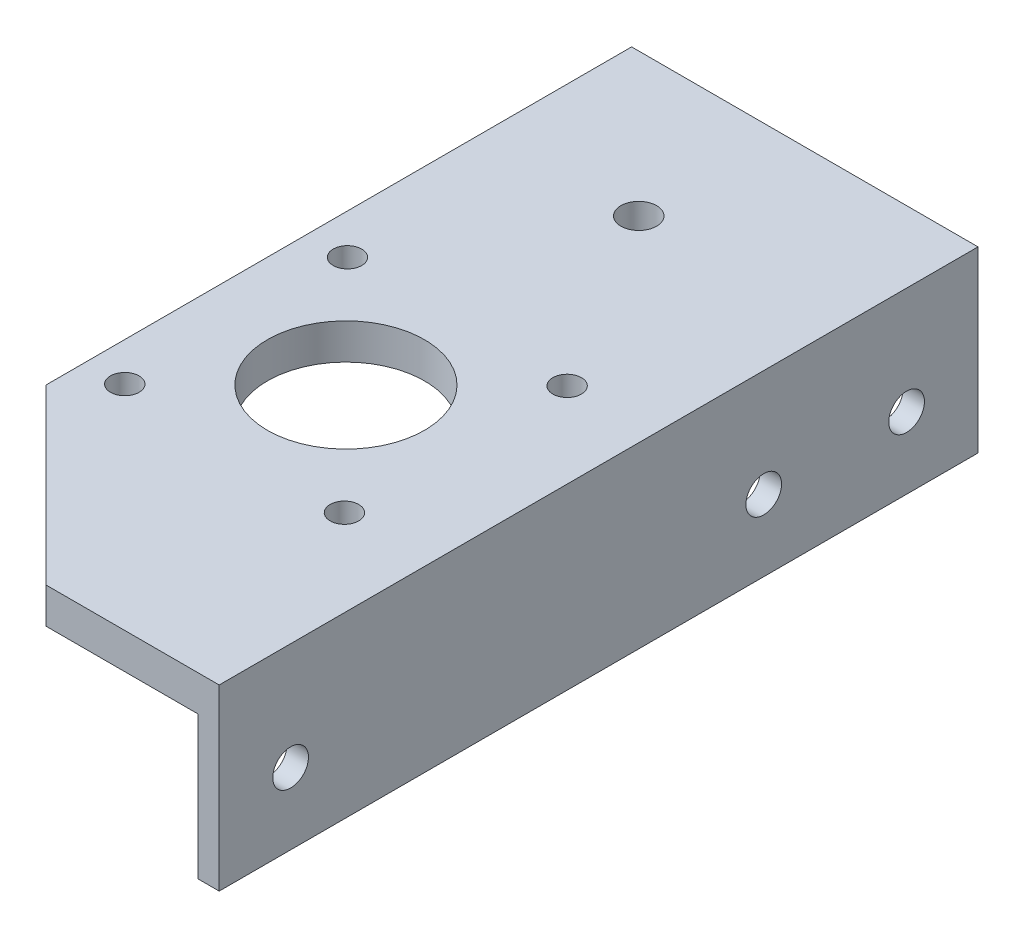
ISO-10303-21;
HEADER;
FILE_DESCRIPTION(('STEP AP214'),'2;1');
FILE_NAME('part.step','',(''),(''),'','','');
FILE_SCHEMA(('AUTOMOTIVE_DESIGN { 1 0 10303 214 1 1 1 1 }'));
ENDSEC;
DATA;
#1=APPLICATION_CONTEXT('core data for automotive mechanical design processes');
#2=APPLICATION_PROTOCOL_DEFINITION('international standard','automotive_design',2000,#1);
#3=PRODUCT_CONTEXT('',#1,'mechanical');
#4=PRODUCT('Part','Part','',(#3));
#5=PRODUCT_RELATED_PRODUCT_CATEGORY('part','',(#4));
#6=PRODUCT_DEFINITION_FORMATION('','',#4);
#7=PRODUCT_DEFINITION_CONTEXT('part definition',#1,'design');
#8=PRODUCT_DEFINITION('design','',#6,#7);
#9=PRODUCT_DEFINITION_SHAPE('','',#8);
#10=(LENGTH_UNIT() NAMED_UNIT(*) SI_UNIT(.MILLI.,.METRE.));
#11=(NAMED_UNIT(*) PLANE_ANGLE_UNIT() SI_UNIT($,.RADIAN.));
#12=(NAMED_UNIT(*) SI_UNIT($,.STERADIAN.) SOLID_ANGLE_UNIT());
#13=UNCERTAINTY_MEASURE_WITH_UNIT(LENGTH_MEASURE(1.E-05),#10,'distance_accuracy_value','');
#14=(GEOMETRIC_REPRESENTATION_CONTEXT(3) GLOBAL_UNCERTAINTY_ASSIGNED_CONTEXT((#13)) GLOBAL_UNIT_ASSIGNED_CONTEXT((#10,
#11,#12)) REPRESENTATION_CONTEXT('',''));
#15=CARTESIAN_POINT('',(0.,0.,0.));
#16=DIRECTION('',(0.,0.,1.));
#17=DIRECTION('',(1.,0.,0.));
#18=AXIS2_PLACEMENT_3D('',#15,#16,#17);
#19=CARTESIAN_POINT('',(0.,5.,80.));
#20=DIRECTION('',(0.,-1.,0.));
#21=DIRECTION('',(0.,0.,-1.));
#22=AXIS2_PLACEMENT_3D('',#19,#20,#21);
#23=PLANE('',#22);
#24=CARTESIAN_POINT('',(0.,5.,39.));
#25=DIRECTION('',(0.,-1.,0.));
#26=DIRECTION('',(0.,0.,-1.));
#27=AXIS2_PLACEMENT_3D('',#24,#25,#26);
#28=CIRCLE('',#27,2.5);
#29=CARTESIAN_POINT('',(0.,4.99999999999999,36.5));
#30=VERTEX_POINT('',#29);
#31=EDGE_CURVE('E229',#30,#30,#28,.T.);
#32=ORIENTED_EDGE('',*,*,#31,.T.);
#33=EDGE_LOOP('',(#32));
#34=FACE_BOUND('',#33,.T.);
#35=DIRECTION('',(-1.,0.,0.));
#36=VECTOR('',#35,1.);
#37=CARTESIAN_POINT('',(-21.,5.,19.));
#38=LINE('',#37,#36);
#39=CARTESIAN_POINT('',(27.5,5.,19.));
#40=VERTEX_POINT('',#39);
#41=CARTESIAN_POINT('',(-21.,5.,19.));
#42=VERTEX_POINT('',#41);
#43=EDGE_CURVE('E177',#40,#42,#38,.T.);
#44=ORIENTED_EDGE('',*,*,#43,.T.);
#45=DIRECTION('',(0.,0.,1.));
#46=VECTOR('',#45,1.);
#47=CARTESIAN_POINT('',(-21.,5.,101.));
#48=LINE('',#47,#46);
#49=CARTESIAN_POINT('',(-21.,5.,101.));
#50=VERTEX_POINT('',#49);
#51=EDGE_CURVE('E109',#42,#50,#48,.T.);
#52=ORIENTED_EDGE('',*,*,#51,.T.);
#53=DIRECTION('',(-0.707106781186548,0.,-0.707106781186548));
#54=VECTOR('',#53,1.);
#55=CARTESIAN_POINT('',(3.25000000000001,5.,125.25));
#56=LINE('',#55,#54);
#57=CARTESIAN_POINT('',(3.25000000000001,5.,125.25));
#58=VERTEX_POINT('',#57);
#59=EDGE_CURVE('E105',#58,#50,#56,.T.);
#60=ORIENTED_EDGE('',*,*,#59,.F.);
#61=DIRECTION('',(-1.,0.,0.));
#62=VECTOR('',#61,1.);
#63=CARTESIAN_POINT('',(3.25000000000001,5.,125.25));
#64=LINE('',#63,#62);
#65=CARTESIAN_POINT('',(27.5,5.,125.25));
#66=VERTEX_POINT('',#65);
#67=EDGE_CURVE('E152',#66,#58,#64,.T.);
#68=ORIENTED_EDGE('',*,*,#67,.F.);
#69=DIRECTION('',(0.,0.,-1.));
#70=VECTOR('',#69,1.);
#71=CARTESIAN_POINT('',(27.5,5.,126.831182706179));
#72=LINE('',#71,#70);
#73=EDGE_CURVE('E165',#66,#40,#72,.T.);
#74=ORIENTED_EDGE('',*,*,#73,.T.);
#75=EDGE_LOOP('',(#44,#52,#60,#68,#74));
#76=FACE_BOUND('',#75,.T.);
#77=CARTESIAN_POINT('',(0.,5.,80.));
#78=DIRECTION('',(0.,1.,0.));
#79=DIRECTION('',(0.,0.,1.));
#80=AXIS2_PLACEMENT_3D('',#77,#78,#79);
#81=CIRCLE('',#80,11.);
#82=CARTESIAN_POINT('',(0.,5.,91.));
#83=VERTEX_POINT('',#82);
#84=EDGE_CURVE('E120',#83,#83,#81,.T.);
#85=ORIENTED_EDGE('',*,*,#84,.F.);
#86=EDGE_LOOP('',(#85));
#87=FACE_BOUND('',#86,.T.);
#88=CARTESIAN_POINT('',(-15.592519129157,5.,95.3780150606921));
#89=DIRECTION('',(0.,1.,0.));
#90=DIRECTION('',(0.,0.,1.));
#91=AXIS2_PLACEMENT_3D('',#88,#89,#90);
#92=CIRCLE('',#91,2.);
#93=CARTESIAN_POINT('',(-15.592519129157,5.,97.3780150606921));
#94=VERTEX_POINT('',#93);
#95=EDGE_CURVE('E199',#94,#94,#92,.T.);
#96=ORIENTED_EDGE('',*,*,#95,.F.);
#97=EDGE_LOOP('',(#96));
#98=FACE_BOUND('',#97,.T.);
#99=CARTESIAN_POINT('',(-15.3780150606921,5.,64.407480870843));
#100=DIRECTION('',(0.,1.,0.));
#101=DIRECTION('',(0.,0.,1.));
#102=AXIS2_PLACEMENT_3D('',#99,#100,#101);
#103=CIRCLE('',#102,2.);
#104=CARTESIAN_POINT('',(-15.3780150606921,5.,66.407480870843));
#105=VERTEX_POINT('',#104);
#106=EDGE_CURVE('E193',#105,#105,#103,.T.);
#107=ORIENTED_EDGE('',*,*,#106,.F.);
#108=EDGE_LOOP('',(#107));
#109=FACE_BOUND('',#108,.T.);
#110=CARTESIAN_POINT('',(15.592519129157,5.,64.6219849393079));
#111=DIRECTION('',(0.,1.,0.));
#112=DIRECTION('',(0.,0.,1.));
#113=AXIS2_PLACEMENT_3D('',#110,#111,#112);
#114=CIRCLE('',#113,2.);
#115=CARTESIAN_POINT('',(15.592519129157,5.,66.6219849393079));
#116=VERTEX_POINT('',#115);
#117=EDGE_CURVE('E187',#116,#116,#114,.T.);
#118=ORIENTED_EDGE('',*,*,#117,.F.);
#119=EDGE_LOOP('',(#118));
#120=FACE_BOUND('',#119,.T.);
#121=CARTESIAN_POINT('',(15.3780150606921,5.,95.592519129157));
#122=DIRECTION('',(0.,1.,0.));
#123=DIRECTION('',(0.,0.,1.));
#124=AXIS2_PLACEMENT_3D('',#121,#122,#123);
#125=CIRCLE('',#124,2.);
#126=CARTESIAN_POINT('',(15.3780150606921,5.,97.5925191291571));
#127=VERTEX_POINT('',#126);
#128=EDGE_CURVE('E181',#127,#127,#125,.T.);
#129=ORIENTED_EDGE('',*,*,#128,.F.);
#130=EDGE_LOOP('',(#129));
#131=FACE_BOUND('',#130,.T.);
#132=ADVANCED_FACE('F37',(#34,#76,#87,#98,#109,#120,#131),#23,.F.);
#133=CARTESIAN_POINT('',(0.,0.,80.));
#134=DIRECTION('',(0.,-1.,0.));
#135=DIRECTION('',(0.,0.,-1.));
#136=AXIS2_PLACEMENT_3D('',#133,#134,#135);
#137=PLANE('',#136);
#138=CARTESIAN_POINT('',(0.,0.,39.));
#139=DIRECTION('',(0.,1.,0.));
#140=DIRECTION('',(0.,0.,1.));
#141=AXIS2_PLACEMENT_3D('',#138,#139,#140);
#142=CIRCLE('',#141,2.5);
#143=CARTESIAN_POINT('',(0.,0.,36.5));
#144=VERTEX_POINT('',#143);
#145=EDGE_CURVE('E41',#144,#144,#142,.T.);
#146=ORIENTED_EDGE('',*,*,#145,.T.);
#147=EDGE_LOOP('',(#146));
#148=FACE_BOUND('',#147,.T.);
#149=CARTESIAN_POINT('',(15.592519129157,0.,64.6219849393079));
#150=DIRECTION('',(0.,1.,0.));
#151=DIRECTION('',(0.,0.,1.));
#152=AXIS2_PLACEMENT_3D('',#149,#150,#151);
#153=CIRCLE('',#152,2.);
#154=CARTESIAN_POINT('',(15.592519129157,0.,66.6219849393079));
#155=VERTEX_POINT('',#154);
#156=EDGE_CURVE('E184',#155,#155,#153,.T.);
#157=ORIENTED_EDGE('',*,*,#156,.T.);
#158=EDGE_LOOP('',(#157));
#159=FACE_BOUND('',#158,.T.);
#160=CARTESIAN_POINT('',(-15.592519129157,0.,95.3780150606921));
#161=DIRECTION('',(0.,1.,0.));
#162=DIRECTION('',(0.,0.,1.));
#163=AXIS2_PLACEMENT_3D('',#160,#161,#162);
#164=CIRCLE('',#163,2.);
#165=CARTESIAN_POINT('',(-15.592519129157,0.,97.3780150606921));
#166=VERTEX_POINT('',#165);
#167=EDGE_CURVE('E196',#166,#166,#164,.T.);
#168=ORIENTED_EDGE('',*,*,#167,.T.);
#169=EDGE_LOOP('',(#168));
#170=FACE_BOUND('',#169,.T.);
#171=DIRECTION('',(0.,0.,1.));
#172=VECTOR('',#171,1.);
#173=CARTESIAN_POINT('',(-21.,0.,101.));
#174=LINE('',#173,#172);
#175=CARTESIAN_POINT('',(-21.,0.,19.));
#176=VERTEX_POINT('',#175);
#177=CARTESIAN_POINT('',(-21.,0.,101.));
#178=VERTEX_POINT('',#177);
#179=EDGE_CURVE('E116',#176,#178,#174,.T.);
#180=ORIENTED_EDGE('',*,*,#179,.F.);
#181=DIRECTION('',(1.,0.,0.));
#182=VECTOR('',#181,1.);
#183=CARTESIAN_POINT('',(-21.,0.,19.));
#184=LINE('',#183,#182);
#185=CARTESIAN_POINT('',(24.5,0.,19.));
#186=VERTEX_POINT('',#185);
#187=EDGE_CURVE('E175',#176,#186,#184,.T.);
#188=ORIENTED_EDGE('',*,*,#187,.T.);
#189=DIRECTION('',(0.,0.,-1.));
#190=VECTOR('',#189,1.);
#191=CARTESIAN_POINT('',(24.5,0.,126.831182706179));
#192=LINE('',#191,#190);
#193=CARTESIAN_POINT('',(24.5,0.,125.25));
#194=VERTEX_POINT('',#193);
#195=EDGE_CURVE('E164',#194,#186,#192,.T.);
#196=ORIENTED_EDGE('',*,*,#195,.F.);
#197=DIRECTION('',(1.,0.,0.));
#198=VECTOR('',#197,1.);
#199=CARTESIAN_POINT('',(3.25000000000001,0.,125.25));
#200=LINE('',#199,#198);
#201=CARTESIAN_POINT('',(3.25000000000001,0.,125.25));
#202=VERTEX_POINT('',#201);
#203=EDGE_CURVE('E46',#202,#194,#200,.T.);
#204=ORIENTED_EDGE('',*,*,#203,.F.);
#205=DIRECTION('',(0.707106781186548,0.,0.707106781186548));
#206=VECTOR('',#205,1.);
#207=CARTESIAN_POINT('',(3.25000000000001,0.,125.25));
#208=LINE('',#207,#206);
#209=EDGE_CURVE('E102',#178,#202,#208,.T.);
#210=ORIENTED_EDGE('',*,*,#209,.F.);
#211=EDGE_LOOP('',(#180,#188,#196,#204,#210));
#212=FACE_BOUND('',#211,.T.);
#213=CARTESIAN_POINT('',(0.,0.,80.));
#214=DIRECTION('',(0.,1.,0.));
#215=DIRECTION('',(0.,0.,1.));
#216=AXIS2_PLACEMENT_3D('',#213,#214,#215);
#217=CIRCLE('',#216,11.);
#218=CARTESIAN_POINT('',(0.,0.,91.));
#219=VERTEX_POINT('',#218);
#220=EDGE_CURVE('E124',#219,#219,#217,.T.);
#221=ORIENTED_EDGE('',*,*,#220,.T.);
#222=EDGE_LOOP('',(#221));
#223=FACE_BOUND('',#222,.T.);
#224=CARTESIAN_POINT('',(-15.3780150606921,0.,64.407480870843));
#225=DIRECTION('',(0.,1.,0.));
#226=DIRECTION('',(0.,0.,1.));
#227=AXIS2_PLACEMENT_3D('',#224,#225,#226);
#228=CIRCLE('',#227,2.);
#229=CARTESIAN_POINT('',(-15.3780150606921,0.,66.407480870843));
#230=VERTEX_POINT('',#229);
#231=EDGE_CURVE('E190',#230,#230,#228,.T.);
#232=ORIENTED_EDGE('',*,*,#231,.T.);
#233=EDGE_LOOP('',(#232));
#234=FACE_BOUND('',#233,.T.);
#235=CARTESIAN_POINT('',(15.3780150606921,0.,95.592519129157));
#236=DIRECTION('',(0.,1.,0.));
#237=DIRECTION('',(0.,0.,1.));
#238=AXIS2_PLACEMENT_3D('',#235,#236,#237);
#239=CIRCLE('',#238,2.);
#240=CARTESIAN_POINT('',(15.3780150606921,0.,97.5925191291571));
#241=VERTEX_POINT('',#240);
#242=EDGE_CURVE('E180',#241,#241,#239,.T.);
#243=ORIENTED_EDGE('',*,*,#242,.T.);
#244=EDGE_LOOP('',(#243));
#245=FACE_BOUND('',#244,.T.);
#246=ADVANCED_FACE('F113',(#148,#159,#170,#212,#223,#234,#245),#137,.T.);
#247=CARTESIAN_POINT('',(-21.,5.,101.));
#248=DIRECTION('',(1.,0.,0.));
#249=DIRECTION('',(0.,0.,-1.));
#250=AXIS2_PLACEMENT_3D('',#247,#248,#249);
#251=PLANE('',#250);
#252=ORIENTED_EDGE('',*,*,#179,.T.);
#253=DIRECTION('',(0.,-1.,0.));
#254=VECTOR('',#253,1.);
#255=CARTESIAN_POINT('',(-21.,5.,101.));
#256=LINE('',#255,#254);
#257=EDGE_CURVE('E99',#50,#178,#256,.T.);
#258=ORIENTED_EDGE('',*,*,#257,.F.);
#259=ORIENTED_EDGE('',*,*,#51,.F.);
#260=DIRECTION('',(0.,-1.,0.));
#261=VECTOR('',#260,1.);
#262=CARTESIAN_POINT('',(-21.,5.,19.));
#263=LINE('',#262,#261);
#264=EDGE_CURVE('E62',#42,#176,#263,.T.);
#265=ORIENTED_EDGE('',*,*,#264,.T.);
#266=EDGE_LOOP('',(#252,#258,#259,#265));
#267=FACE_BOUND('',#266,.T.);
#268=ADVANCED_FACE('F39',(#267),#251,.F.);
#269=CARTESIAN_POINT('',(0.,5.,80.));
#270=DIRECTION('',(0.,-1.,0.));
#271=DIRECTION('',(0.,0.,-1.));
#272=AXIS2_PLACEMENT_3D('',#269,#270,#271);
#273=CYLINDRICAL_SURFACE('',#272,11.);
#274=ORIENTED_EDGE('',*,*,#84,.T.);
#275=EDGE_LOOP('',(#274));
#276=FACE_BOUND('',#275,.T.);
#277=ORIENTED_EDGE('',*,*,#220,.F.);
#278=EDGE_LOOP('',(#277));
#279=FACE_BOUND('',#278,.T.);
#280=ADVANCED_FACE('F207',(#276,#279),#273,.F.);
#281=CARTESIAN_POINT('',(-15.592519129157,5.,95.3780150606921));
#282=DIRECTION('',(0.,-1.,0.));
#283=DIRECTION('',(0.,0.,-1.));
#284=AXIS2_PLACEMENT_3D('',#281,#282,#283);
#285=CYLINDRICAL_SURFACE('',#284,2.);
#286=ORIENTED_EDGE('',*,*,#95,.T.);
#287=EDGE_LOOP('',(#286));
#288=FACE_BOUND('',#287,.T.);
#289=ORIENTED_EDGE('',*,*,#167,.F.);
#290=EDGE_LOOP('',(#289));
#291=FACE_BOUND('',#290,.T.);
#292=ADVANCED_FACE('F209',(#288,#291),#285,.F.);
#293=CARTESIAN_POINT('',(-15.3780150606921,5.,64.407480870843));
#294=DIRECTION('',(0.,-1.,0.));
#295=DIRECTION('',(0.,0.,-1.));
#296=AXIS2_PLACEMENT_3D('',#293,#294,#295);
#297=CYLINDRICAL_SURFACE('',#296,2.);
#298=ORIENTED_EDGE('',*,*,#106,.T.);
#299=EDGE_LOOP('',(#298));
#300=FACE_BOUND('',#299,.T.);
#301=ORIENTED_EDGE('',*,*,#231,.F.);
#302=EDGE_LOOP('',(#301));
#303=FACE_BOUND('',#302,.T.);
#304=ADVANCED_FACE('F216',(#300,#303),#297,.F.);
#305=CARTESIAN_POINT('',(15.592519129157,5.,64.6219849393079));
#306=DIRECTION('',(0.,-1.,0.));
#307=DIRECTION('',(0.,0.,-1.));
#308=AXIS2_PLACEMENT_3D('',#305,#306,#307);
#309=CYLINDRICAL_SURFACE('',#308,2.);
#310=ORIENTED_EDGE('',*,*,#117,.T.);
#311=EDGE_LOOP('',(#310));
#312=FACE_BOUND('',#311,.T.);
#313=ORIENTED_EDGE('',*,*,#156,.F.);
#314=EDGE_LOOP('',(#313));
#315=FACE_BOUND('',#314,.T.);
#316=ADVANCED_FACE('F245',(#312,#315),#309,.F.);
#317=CARTESIAN_POINT('',(15.3780150606921,5.,95.592519129157));
#318=DIRECTION('',(0.,-1.,0.));
#319=DIRECTION('',(0.,0.,-1.));
#320=AXIS2_PLACEMENT_3D('',#317,#318,#319);
#321=CYLINDRICAL_SURFACE('',#320,2.);
#322=ORIENTED_EDGE('',*,*,#128,.T.);
#323=EDGE_LOOP('',(#322));
#324=FACE_BOUND('',#323,.T.);
#325=ORIENTED_EDGE('',*,*,#242,.F.);
#326=EDGE_LOOP('',(#325));
#327=FACE_BOUND('',#326,.T.);
#328=ADVANCED_FACE('F241',(#324,#327),#321,.F.);
#329=CARTESIAN_POINT('',(0.,0.,19.));
#330=DIRECTION('',(0.,0.,-1.));
#331=DIRECTION('',(1.,0.,0.));
#332=AXIS2_PLACEMENT_3D('',#329,#330,#331);
#333=PLANE('',#332);
#334=ORIENTED_EDGE('',*,*,#264,.F.);
#335=ORIENTED_EDGE('',*,*,#43,.F.);
#336=DIRECTION('',(0.,-1.,0.));
#337=VECTOR('',#336,1.);
#338=CARTESIAN_POINT('',(27.5,0.,19.));
#339=LINE('',#338,#337);
#340=CARTESIAN_POINT('',(27.5,-20.,19.));
#341=VERTEX_POINT('',#340);
#342=EDGE_CURVE('E161',#40,#341,#339,.T.);
#343=ORIENTED_EDGE('',*,*,#342,.T.);
#344=DIRECTION('',(-1.,0.,0.));
#345=VECTOR('',#344,1.);
#346=CARTESIAN_POINT('',(0.,-20.,19.));
#347=LINE('',#346,#345);
#348=CARTESIAN_POINT('',(24.5,-20.,19.));
#349=VERTEX_POINT('',#348);
#350=EDGE_CURVE('E158',#341,#349,#347,.T.);
#351=ORIENTED_EDGE('',*,*,#350,.T.);
#352=DIRECTION('',(0.,1.,0.));
#353=VECTOR('',#352,1.);
#354=CARTESIAN_POINT('',(24.5,0.,19.));
#355=LINE('',#354,#353);
#356=EDGE_CURVE('E150',#349,#186,#355,.T.);
#357=ORIENTED_EDGE('',*,*,#356,.T.);
#358=ORIENTED_EDGE('',*,*,#187,.F.);
#359=EDGE_LOOP('',(#334,#335,#343,#351,#357,#358));
#360=FACE_BOUND('',#359,.T.);
#361=ADVANCED_FACE('F244',(#360),#333,.T.);
#362=CARTESIAN_POINT('',(24.5,0.,126.831182706179));
#363=DIRECTION('',(1.,0.,0.));
#364=DIRECTION('',(0.,0.,1.));
#365=AXIS2_PLACEMENT_3D('',#362,#363,#364);
#366=PLANE('',#365);
#367=CARTESIAN_POINT('',(24.5,-10.,49.));
#368=DIRECTION('',(1.,0.,0.));
#369=DIRECTION('',(0.,0.,-1.));
#370=AXIS2_PLACEMENT_3D('',#367,#368,#369);
#371=CIRCLE('',#370,2.5);
#372=CARTESIAN_POINT('',(24.5,-10.,46.5));
#373=VERTEX_POINT('',#372);
#374=EDGE_CURVE('E135',#373,#373,#371,.T.);
#375=ORIENTED_EDGE('',*,*,#374,.T.);
#376=EDGE_LOOP('',(#375));
#377=FACE_BOUND('',#376,.T.);
#378=CARTESIAN_POINT('',(24.5,-10.,115.25));
#379=DIRECTION('',(1.,0.,0.));
#380=DIRECTION('',(0.,0.,-1.));
#381=AXIS2_PLACEMENT_3D('',#378,#379,#380);
#382=CIRCLE('',#381,2.50000000000001);
#383=CARTESIAN_POINT('',(24.5,-10.,112.75));
#384=VERTEX_POINT('',#383);
#385=EDGE_CURVE('E144',#384,#384,#382,.T.);
#386=ORIENTED_EDGE('',*,*,#385,.T.);
#387=EDGE_LOOP('',(#386));
#388=FACE_BOUND('',#387,.T.);
#389=CARTESIAN_POINT('',(24.5,-10.,29.));
#390=DIRECTION('',(1.,0.,0.));
#391=DIRECTION('',(0.,0.,-1.));
#392=AXIS2_PLACEMENT_3D('',#389,#390,#391);
#393=CIRCLE('',#392,2.5);
#394=CARTESIAN_POINT('',(24.5,-10.,26.5));
#395=VERTEX_POINT('',#394);
#396=EDGE_CURVE('E131',#395,#395,#393,.T.);
#397=ORIENTED_EDGE('',*,*,#396,.T.);
#398=EDGE_LOOP('',(#397));
#399=FACE_BOUND('',#398,.T.);
#400=ORIENTED_EDGE('',*,*,#195,.T.);
#401=ORIENTED_EDGE('',*,*,#356,.F.);
#402=DIRECTION('',(0.,0.,-1.));
#403=VECTOR('',#402,1.);
#404=CARTESIAN_POINT('',(24.5,-20.,126.831182706179));
#405=LINE('',#404,#403);
#406=CARTESIAN_POINT('',(24.5,-20.,125.25));
#407=VERTEX_POINT('',#406);
#408=EDGE_CURVE('E170',#407,#349,#405,.T.);
#409=ORIENTED_EDGE('',*,*,#408,.F.);
#410=DIRECTION('',(0.,-1.,0.));
#411=VECTOR('',#410,1.);
#412=CARTESIAN_POINT('',(24.5,-74.2246484543699,125.25));
#413=LINE('',#412,#411);
#414=EDGE_CURVE('E11',#194,#407,#413,.T.);
#415=ORIENTED_EDGE('',*,*,#414,.F.);
#416=EDGE_LOOP('',(#400,#401,#409,#415));
#417=FACE_BOUND('',#416,.T.);
#418=ADVANCED_FACE('F253',(#377,#388,#399,#417),#366,.F.);
#419=CARTESIAN_POINT('',(0.,-20.,126.831182706179));
#420=DIRECTION('',(0.,1.,0.));
#421=DIRECTION('',(0.,0.,-1.));
#422=AXIS2_PLACEMENT_3D('',#419,#420,#421);
#423=PLANE('',#422);
#424=ORIENTED_EDGE('',*,*,#408,.T.);
#425=ORIENTED_EDGE('',*,*,#350,.F.);
#426=DIRECTION('',(0.,0.,-1.));
#427=VECTOR('',#426,1.);
#428=CARTESIAN_POINT('',(27.5,-20.,126.831182706179));
#429=LINE('',#428,#427);
#430=CARTESIAN_POINT('',(27.5,-20.,125.25));
#431=VERTEX_POINT('',#430);
#432=EDGE_CURVE('E168',#431,#341,#429,.T.);
#433=ORIENTED_EDGE('',*,*,#432,.F.);
#434=DIRECTION('',(1.,0.,0.));
#435=VECTOR('',#434,1.);
#436=CARTESIAN_POINT('',(3.25000000000001,-20.,125.25));
#437=LINE('',#436,#435);
#438=EDGE_CURVE('E147',#407,#431,#437,.T.);
#439=ORIENTED_EDGE('',*,*,#438,.F.);
#440=EDGE_LOOP('',(#424,#425,#433,#439));
#441=FACE_BOUND('',#440,.T.);
#442=ADVANCED_FACE('F292',(#441),#423,.F.);
#443=CARTESIAN_POINT('',(27.5,0.,126.831182706179));
#444=DIRECTION('',(-1.,0.,0.));
#445=DIRECTION('',(0.,-1.,0.));
#446=AXIS2_PLACEMENT_3D('',#443,#444,#445);
#447=PLANE('',#446);
#448=CARTESIAN_POINT('',(27.5,-10.,49.));
#449=DIRECTION('',(1.,0.,0.));
#450=DIRECTION('',(0.,-1.,0.));
#451=AXIS2_PLACEMENT_3D('',#448,#449,#450);
#452=CIRCLE('',#451,2.5);
#453=CARTESIAN_POINT('',(27.5,-10.,46.5));
#454=VERTEX_POINT('',#453);
#455=EDGE_CURVE('E134',#454,#454,#452,.T.);
#456=ORIENTED_EDGE('',*,*,#455,.F.);
#457=EDGE_LOOP('',(#456));
#458=FACE_BOUND('',#457,.T.);
#459=CARTESIAN_POINT('',(27.5,-10.,115.25));
#460=DIRECTION('',(1.,0.,0.));
#461=DIRECTION('',(0.,-1.,0.));
#462=AXIS2_PLACEMENT_3D('',#459,#460,#461);
#463=CIRCLE('',#462,2.50000000000001);
#464=CARTESIAN_POINT('',(27.5,-10.,112.75));
#465=VERTEX_POINT('',#464);
#466=EDGE_CURVE('E132',#465,#465,#463,.T.);
#467=ORIENTED_EDGE('',*,*,#466,.F.);
#468=EDGE_LOOP('',(#467));
#469=FACE_BOUND('',#468,.T.);
#470=CARTESIAN_POINT('',(27.5,-10.,29.));
#471=DIRECTION('',(1.,0.,0.));
#472=DIRECTION('',(0.,-1.,0.));
#473=AXIS2_PLACEMENT_3D('',#470,#471,#472);
#474=CIRCLE('',#473,2.5);
#475=CARTESIAN_POINT('',(27.5,-10.,26.5));
#476=VERTEX_POINT('',#475);
#477=EDGE_CURVE('E118',#476,#476,#474,.T.);
#478=ORIENTED_EDGE('',*,*,#477,.F.);
#479=EDGE_LOOP('',(#478));
#480=FACE_BOUND('',#479,.T.);
#481=ORIENTED_EDGE('',*,*,#432,.T.);
#482=ORIENTED_EDGE('',*,*,#342,.F.);
#483=ORIENTED_EDGE('',*,*,#73,.F.);
#484=DIRECTION('',(0.,1.,0.));
#485=VECTOR('',#484,1.);
#486=CARTESIAN_POINT('',(27.5,-74.2246484543699,125.25));
#487=LINE('',#486,#485);
#488=EDGE_CURVE('E154',#431,#66,#487,.T.);
#489=ORIENTED_EDGE('',*,*,#488,.F.);
#490=EDGE_LOOP('',(#481,#482,#483,#489));
#491=FACE_BOUND('',#490,.T.);
#492=ADVANCED_FACE('F302',(#458,#469,#480,#491),#447,.F.);
#493=CARTESIAN_POINT('',(3.25000000000001,-74.2246484543699,125.25));
#494=DIRECTION('',(-0.707106781186548,0.,0.707106781186548));
#495=DIRECTION('',(-0.707106781186548,0.,-0.707106781186548));
#496=AXIS2_PLACEMENT_3D('',#493,#494,#495);
#497=PLANE('',#496);
#498=ORIENTED_EDGE('',*,*,#209,.T.);
#499=DIRECTION('',(0.,1.,0.));
#500=VECTOR('',#499,1.);
#501=CARTESIAN_POINT('',(3.25000000000001,-74.2246484543699,125.25));
#502=LINE('',#501,#500);
#503=EDGE_CURVE('E54',#202,#58,#502,.T.);
#504=ORIENTED_EDGE('',*,*,#503,.T.);
#505=ORIENTED_EDGE('',*,*,#59,.T.);
#506=ORIENTED_EDGE('',*,*,#257,.T.);
#507=EDGE_LOOP('',(#498,#504,#505,#506));
#508=FACE_BOUND('',#507,.T.);
#509=ADVANCED_FACE('F101',(#508),#497,.T.);
#510=CARTESIAN_POINT('',(3.25000000000001,-74.2246484543699,125.25));
#511=DIRECTION('',(0.,0.,1.));
#512=DIRECTION('',(-1.,0.,0.));
#513=AXIS2_PLACEMENT_3D('',#510,#511,#512);
#514=PLANE('',#513);
#515=ORIENTED_EDGE('',*,*,#414,.T.);
#516=ORIENTED_EDGE('',*,*,#438,.T.);
#517=ORIENTED_EDGE('',*,*,#488,.T.);
#518=ORIENTED_EDGE('',*,*,#67,.T.);
#519=ORIENTED_EDGE('',*,*,#503,.F.);
#520=ORIENTED_EDGE('',*,*,#203,.T.);
#521=EDGE_LOOP('',(#515,#516,#517,#518,#519,#520));
#522=FACE_BOUND('',#521,.T.);
#523=ADVANCED_FACE('F322',(#522),#514,.T.);
#524=CARTESIAN_POINT('',(106.5,-10.,29.));
#525=DIRECTION('',(-1.,0.,0.));
#526=DIRECTION('',(0.,0.,-1.));
#527=AXIS2_PLACEMENT_3D('',#524,#525,#526);
#528=CYLINDRICAL_SURFACE('',#527,2.5);
#529=CARTESIAN_POINT('',(24.5,-10.,26.5));
#530=CARTESIAN_POINT('',(24.53125,-10.,26.5));
#531=CARTESIAN_POINT('',(24.5625,-10.,26.5));
#532=CARTESIAN_POINT('',(24.625,-10.,26.5));
#533=CARTESIAN_POINT('',(24.65625,-10.,26.5));
#534=CARTESIAN_POINT('',(24.71875,-10.,26.5));
#535=CARTESIAN_POINT('',(24.75,-10.,26.5));
#536=CARTESIAN_POINT('',(24.8125,-10.,26.5));
#537=CARTESIAN_POINT('',(24.84375,-10.,26.5));
#538=CARTESIAN_POINT('',(24.90625,-10.,26.5));
#539=CARTESIAN_POINT('',(24.9375,-10.,26.5));
#540=CARTESIAN_POINT('',(25.,-10.,26.5));
#541=CARTESIAN_POINT('',(25.03125,-10.,26.5));
#542=CARTESIAN_POINT('',(25.09375,-10.,26.5));
#543=CARTESIAN_POINT('',(25.125,-10.,26.5));
#544=CARTESIAN_POINT('',(25.1875,-10.,26.5));
#545=CARTESIAN_POINT('',(25.21875,-10.,26.5));
#546=CARTESIAN_POINT('',(25.28125,-10.,26.5));
#547=CARTESIAN_POINT('',(25.3125,-10.,26.5));
#548=CARTESIAN_POINT('',(25.375,-10.,26.5));
#549=CARTESIAN_POINT('',(25.40625,-10.,26.5));
#550=CARTESIAN_POINT('',(25.46875,-10.,26.5));
#551=CARTESIAN_POINT('',(25.5,-10.,26.5));
#552=CARTESIAN_POINT('',(25.5625,-10.,26.5));
#553=CARTESIAN_POINT('',(25.59375,-10.,26.5));
#554=CARTESIAN_POINT('',(25.65625,-10.,26.5));
#555=CARTESIAN_POINT('',(25.6875,-10.,26.5));
#556=CARTESIAN_POINT('',(25.75,-10.,26.5));
#557=CARTESIAN_POINT('',(25.78125,-10.,26.5));
#558=CARTESIAN_POINT('',(25.84375,-10.,26.5));
#559=CARTESIAN_POINT('',(25.875,-10.,26.5));
#560=CARTESIAN_POINT('',(25.9375,-10.,26.5));
#561=CARTESIAN_POINT('',(25.96875,-10.,26.5));
#562=CARTESIAN_POINT('',(26.03125,-10.,26.5));
#563=CARTESIAN_POINT('',(26.0625,-10.,26.5));
#564=CARTESIAN_POINT('',(26.125,-10.,26.5));
#565=CARTESIAN_POINT('',(26.15625,-10.,26.5));
#566=CARTESIAN_POINT('',(26.21875,-10.,26.5));
#567=CARTESIAN_POINT('',(26.25,-10.,26.5));
#568=CARTESIAN_POINT('',(26.3125,-10.,26.5));
#569=CARTESIAN_POINT('',(26.34375,-10.,26.5));
#570=CARTESIAN_POINT('',(26.40625,-10.,26.5));
#571=CARTESIAN_POINT('',(26.4375,-10.,26.5));
#572=CARTESIAN_POINT('',(26.5,-10.,26.5));
#573=CARTESIAN_POINT('',(26.53125,-10.,26.5));
#574=CARTESIAN_POINT('',(26.59375,-10.,26.5));
#575=CARTESIAN_POINT('',(26.625,-10.,26.5));
#576=CARTESIAN_POINT('',(26.6875,-10.,26.5));
#577=CARTESIAN_POINT('',(26.71875,-10.,26.5));
#578=CARTESIAN_POINT('',(26.78125,-10.,26.5));
#579=CARTESIAN_POINT('',(26.8125,-10.,26.5));
#580=CARTESIAN_POINT('',(26.875,-10.,26.5));
#581=CARTESIAN_POINT('',(26.90625,-10.,26.5));
#582=CARTESIAN_POINT('',(26.96875,-10.,26.5));
#583=CARTESIAN_POINT('',(27.,-10.,26.5));
#584=CARTESIAN_POINT('',(27.0625,-10.,26.5));
#585=CARTESIAN_POINT('',(27.09375,-10.,26.5));
#586=CARTESIAN_POINT('',(27.15625,-10.,26.5));
#587=CARTESIAN_POINT('',(27.1875,-10.,26.5));
#588=CARTESIAN_POINT('',(27.25,-10.,26.5));
#589=CARTESIAN_POINT('',(27.28125,-10.,26.5));
#590=CARTESIAN_POINT('',(27.34375,-10.,26.5));
#591=CARTESIAN_POINT('',(27.375,-10.,26.5));
#592=CARTESIAN_POINT('',(27.4375,-10.,26.5));
#593=CARTESIAN_POINT('',(27.46875,-10.,26.5));
#594=CARTESIAN_POINT('',(27.5,-10.,26.5));
#595=B_SPLINE_CURVE_WITH_KNOTS('',3,(#529,#530,#531,#532,#533,#534,#535,#536,#537,#538,#539,
#540,#541,#542,#543,#544,#545,#546,#547,#548,#549,#550,#551,#552,#553,#554,#555,#556,#557,#558,
#559,#560,#561,#562,#563,#564,#565,#566,#567,#568,#569,#570,#571,#572,#573,#574,#575,#576,#577,
#578,#579,#580,#581,#582,#583,#584,#585,#586,#587,#588,#589,#590,#591,#592,#593,#594),
.UNSPECIFIED.,.F.,.F.,(4,2,2,2,2,2,2,2,2,2,2,2,2,2,2,2,2,2,2,2,2,2,2,2,2,2,2,2,2,2,2,2,4),(0.,
0.0937500000000036,0.187499999999993,0.281249999999997,0.375,0.46874999999999,0.562499999999994,
0.656249999999997,0.750000000000001,0.84374999999999,0.937499999999994,1.03125,1.12499999999999,
1.21874999999999,1.31249999999999,1.40624999999998,1.49999999999999,1.59374999999999,
1.68749999999998,1.78124999999998,1.87499999999999,1.96874999999998,2.06249999999998,
2.15624999999998,2.24999999999997,2.34374999999998,2.43749999999998,2.53124999999998,
2.62499999999997,2.71874999999998,2.81249999999998,2.90624999999997,2.99999999999998),.UNSPECIFIED.);
#596=EDGE_CURVE('BSEAM331',#395,#476,#595,.T.);
#597=ORIENTED_EDGE('',*,*,#396,.F.);
#598=ORIENTED_EDGE('',*,*,#477,.T.);
#599=ORIENTED_EDGE('',*,*,#596,.T.);
#600=ORIENTED_EDGE('',*,*,#596,.F.);
#601=EDGE_LOOP('',(#597,#599,#598,#600));
#602=FACE_BOUND('',#601,.T.);
#603=ADVANCED_FACE('F331',(#602),#528,.F.);
#604=CARTESIAN_POINT('',(106.5,-10.,115.25));
#605=DIRECTION('',(-1.,0.,0.));
#606=DIRECTION('',(0.,0.,-1.));
#607=AXIS2_PLACEMENT_3D('',#604,#605,#606);
#608=CYLINDRICAL_SURFACE('',#607,2.50000000000001);
#609=CARTESIAN_POINT('',(24.5,-10.,112.75));
#610=CARTESIAN_POINT('',(24.53125,-10.,112.75));
#611=CARTESIAN_POINT('',(24.5625,-10.,112.75));
#612=CARTESIAN_POINT('',(24.625,-10.,112.75));
#613=CARTESIAN_POINT('',(24.65625,-10.,112.75));
#614=CARTESIAN_POINT('',(24.71875,-10.,112.75));
#615=CARTESIAN_POINT('',(24.75,-10.,112.75));
#616=CARTESIAN_POINT('',(24.8125,-10.,112.75));
#617=CARTESIAN_POINT('',(24.84375,-10.,112.75));
#618=CARTESIAN_POINT('',(24.90625,-10.,112.75));
#619=CARTESIAN_POINT('',(24.9375,-10.,112.75));
#620=CARTESIAN_POINT('',(25.,-10.,112.75));
#621=CARTESIAN_POINT('',(25.03125,-10.,112.75));
#622=CARTESIAN_POINT('',(25.09375,-10.,112.75));
#623=CARTESIAN_POINT('',(25.125,-10.,112.75));
#624=CARTESIAN_POINT('',(25.1875,-10.,112.75));
#625=CARTESIAN_POINT('',(25.21875,-10.,112.75));
#626=CARTESIAN_POINT('',(25.28125,-10.,112.75));
#627=CARTESIAN_POINT('',(25.3125,-10.,112.75));
#628=CARTESIAN_POINT('',(25.375,-10.,112.75));
#629=CARTESIAN_POINT('',(25.40625,-10.,112.75));
#630=CARTESIAN_POINT('',(25.46875,-10.,112.75));
#631=CARTESIAN_POINT('',(25.5,-10.,112.75));
#632=CARTESIAN_POINT('',(25.5625,-10.,112.75));
#633=CARTESIAN_POINT('',(25.59375,-10.,112.75));
#634=CARTESIAN_POINT('',(25.65625,-10.,112.75));
#635=CARTESIAN_POINT('',(25.6875,-10.,112.75));
#636=CARTESIAN_POINT('',(25.75,-10.,112.75));
#637=CARTESIAN_POINT('',(25.78125,-10.,112.75));
#638=CARTESIAN_POINT('',(25.84375,-10.,112.75));
#639=CARTESIAN_POINT('',(25.875,-10.,112.75));
#640=CARTESIAN_POINT('',(25.9375,-10.,112.75));
#641=CARTESIAN_POINT('',(25.96875,-10.,112.75));
#642=CARTESIAN_POINT('',(26.03125,-10.,112.75));
#643=CARTESIAN_POINT('',(26.0625,-10.,112.75));
#644=CARTESIAN_POINT('',(26.125,-10.,112.75));
#645=CARTESIAN_POINT('',(26.15625,-10.,112.75));
#646=CARTESIAN_POINT('',(26.21875,-10.,112.75));
#647=CARTESIAN_POINT('',(26.25,-10.,112.75));
#648=CARTESIAN_POINT('',(26.3125,-10.,112.75));
#649=CARTESIAN_POINT('',(26.34375,-10.,112.75));
#650=CARTESIAN_POINT('',(26.40625,-10.,112.75));
#651=CARTESIAN_POINT('',(26.4375,-10.,112.75));
#652=CARTESIAN_POINT('',(26.5,-10.,112.75));
#653=CARTESIAN_POINT('',(26.53125,-10.,112.75));
#654=CARTESIAN_POINT('',(26.59375,-10.,112.75));
#655=CARTESIAN_POINT('',(26.625,-10.,112.75));
#656=CARTESIAN_POINT('',(26.6875,-10.,112.75));
#657=CARTESIAN_POINT('',(26.71875,-10.,112.75));
#658=CARTESIAN_POINT('',(26.78125,-10.,112.75));
#659=CARTESIAN_POINT('',(26.8125,-10.,112.75));
#660=CARTESIAN_POINT('',(26.875,-10.,112.75));
#661=CARTESIAN_POINT('',(26.90625,-10.,112.75));
#662=CARTESIAN_POINT('',(26.96875,-10.,112.75));
#663=CARTESIAN_POINT('',(27.,-10.,112.75));
#664=CARTESIAN_POINT('',(27.0625,-10.,112.75));
#665=CARTESIAN_POINT('',(27.09375,-10.,112.75));
#666=CARTESIAN_POINT('',(27.15625,-10.,112.75));
#667=CARTESIAN_POINT('',(27.1875,-10.,112.75));
#668=CARTESIAN_POINT('',(27.25,-10.,112.75));
#669=CARTESIAN_POINT('',(27.28125,-10.,112.75));
#670=CARTESIAN_POINT('',(27.34375,-10.,112.75));
#671=CARTESIAN_POINT('',(27.375,-10.,112.75));
#672=CARTESIAN_POINT('',(27.4375,-10.,112.75));
#673=CARTESIAN_POINT('',(27.46875,-10.,112.75));
#674=CARTESIAN_POINT('',(27.5,-10.,112.75));
#675=B_SPLINE_CURVE_WITH_KNOTS('',3,(#609,#610,#611,#612,#613,#614,#615,#616,#617,#618,#619,
#620,#621,#622,#623,#624,#625,#626,#627,#628,#629,#630,#631,#632,#633,#634,#635,#636,#637,#638,
#639,#640,#641,#642,#643,#644,#645,#646,#647,#648,#649,#650,#651,#652,#653,#654,#655,#656,#657,
#658,#659,#660,#661,#662,#663,#664,#665,#666,#667,#668,#669,#670,#671,#672,#673,#674),
.UNSPECIFIED.,.F.,.F.,(4,2,2,2,2,2,2,2,2,2,2,2,2,2,2,2,2,2,2,2,2,2,2,2,2,2,2,2,2,2,2,2,4),(0.,
0.0937500000000036,0.187499999999993,0.281249999999997,0.375,0.46874999999999,0.562499999999994,
0.656249999999997,0.750000000000001,0.84374999999999,0.937499999999994,1.03125,1.12499999999999,
1.21874999999999,1.31249999999999,1.40624999999998,1.49999999999999,1.59374999999999,
1.68749999999998,1.78124999999998,1.87499999999999,1.96874999999998,2.06249999999998,
2.15624999999998,2.24999999999997,2.34374999999998,2.43749999999998,2.53124999999998,
2.62499999999997,2.71874999999998,2.81249999999998,2.90624999999997,2.99999999999998),.UNSPECIFIED.);
#676=EDGE_CURVE('BSEAM340',#384,#465,#675,.T.);
#677=ORIENTED_EDGE('',*,*,#385,.F.);
#678=ORIENTED_EDGE('',*,*,#466,.T.);
#679=ORIENTED_EDGE('',*,*,#676,.T.);
#680=ORIENTED_EDGE('',*,*,#676,.F.);
#681=EDGE_LOOP('',(#677,#679,#678,#680));
#682=FACE_BOUND('',#681,.T.);
#683=ADVANCED_FACE('F340',(#682),#608,.F.);
#684=CARTESIAN_POINT('',(106.5,-10.,49.));
#685=DIRECTION('',(-1.,0.,0.));
#686=DIRECTION('',(0.,0.,-1.));
#687=AXIS2_PLACEMENT_3D('',#684,#685,#686);
#688=CYLINDRICAL_SURFACE('',#687,2.5);
#689=CARTESIAN_POINT('',(24.5,-10.,46.5));
#690=CARTESIAN_POINT('',(24.53125,-10.,46.5));
#691=CARTESIAN_POINT('',(24.5625,-10.,46.5));
#692=CARTESIAN_POINT('',(24.625,-10.,46.5));
#693=CARTESIAN_POINT('',(24.65625,-10.,46.5));
#694=CARTESIAN_POINT('',(24.71875,-10.,46.5));
#695=CARTESIAN_POINT('',(24.75,-10.,46.5));
#696=CARTESIAN_POINT('',(24.8125,-10.,46.5));
#697=CARTESIAN_POINT('',(24.84375,-10.,46.5));
#698=CARTESIAN_POINT('',(24.90625,-10.,46.5));
#699=CARTESIAN_POINT('',(24.9375,-10.,46.5));
#700=CARTESIAN_POINT('',(25.,-10.,46.5));
#701=CARTESIAN_POINT('',(25.03125,-10.,46.5));
#702=CARTESIAN_POINT('',(25.09375,-10.,46.5));
#703=CARTESIAN_POINT('',(25.125,-10.,46.5));
#704=CARTESIAN_POINT('',(25.1875,-10.,46.5));
#705=CARTESIAN_POINT('',(25.21875,-10.,46.5));
#706=CARTESIAN_POINT('',(25.28125,-10.,46.5));
#707=CARTESIAN_POINT('',(25.3125,-10.,46.5));
#708=CARTESIAN_POINT('',(25.375,-10.,46.5));
#709=CARTESIAN_POINT('',(25.40625,-10.,46.5));
#710=CARTESIAN_POINT('',(25.46875,-10.,46.5));
#711=CARTESIAN_POINT('',(25.5,-10.,46.5));
#712=CARTESIAN_POINT('',(25.5625,-10.,46.5));
#713=CARTESIAN_POINT('',(25.59375,-10.,46.5));
#714=CARTESIAN_POINT('',(25.65625,-10.,46.5));
#715=CARTESIAN_POINT('',(25.6875,-10.,46.5));
#716=CARTESIAN_POINT('',(25.75,-10.,46.5));
#717=CARTESIAN_POINT('',(25.78125,-10.,46.5));
#718=CARTESIAN_POINT('',(25.84375,-10.,46.5));
#719=CARTESIAN_POINT('',(25.875,-10.,46.5));
#720=CARTESIAN_POINT('',(25.9375,-10.,46.5));
#721=CARTESIAN_POINT('',(25.96875,-10.,46.5));
#722=CARTESIAN_POINT('',(26.03125,-10.,46.5));
#723=CARTESIAN_POINT('',(26.0625,-10.,46.5));
#724=CARTESIAN_POINT('',(26.125,-10.,46.5));
#725=CARTESIAN_POINT('',(26.15625,-10.,46.5));
#726=CARTESIAN_POINT('',(26.21875,-10.,46.5));
#727=CARTESIAN_POINT('',(26.25,-10.,46.5));
#728=CARTESIAN_POINT('',(26.3125,-10.,46.5));
#729=CARTESIAN_POINT('',(26.34375,-10.,46.5));
#730=CARTESIAN_POINT('',(26.40625,-10.,46.5));
#731=CARTESIAN_POINT('',(26.4375,-10.,46.5));
#732=CARTESIAN_POINT('',(26.5,-10.,46.5));
#733=CARTESIAN_POINT('',(26.53125,-10.,46.5));
#734=CARTESIAN_POINT('',(26.59375,-10.,46.5));
#735=CARTESIAN_POINT('',(26.625,-10.,46.5));
#736=CARTESIAN_POINT('',(26.6875,-10.,46.5));
#737=CARTESIAN_POINT('',(26.71875,-10.,46.5));
#738=CARTESIAN_POINT('',(26.78125,-10.,46.5));
#739=CARTESIAN_POINT('',(26.8125,-10.,46.5));
#740=CARTESIAN_POINT('',(26.875,-10.,46.5));
#741=CARTESIAN_POINT('',(26.90625,-10.,46.5));
#742=CARTESIAN_POINT('',(26.96875,-10.,46.5));
#743=CARTESIAN_POINT('',(27.,-10.,46.5));
#744=CARTESIAN_POINT('',(27.0625,-10.,46.5));
#745=CARTESIAN_POINT('',(27.09375,-10.,46.5));
#746=CARTESIAN_POINT('',(27.15625,-10.,46.5));
#747=CARTESIAN_POINT('',(27.1875,-10.,46.5));
#748=CARTESIAN_POINT('',(27.25,-10.,46.5));
#749=CARTESIAN_POINT('',(27.28125,-10.,46.5));
#750=CARTESIAN_POINT('',(27.34375,-10.,46.5));
#751=CARTESIAN_POINT('',(27.375,-10.,46.5));
#752=CARTESIAN_POINT('',(27.4375,-10.,46.5));
#753=CARTESIAN_POINT('',(27.46875,-10.,46.5));
#754=CARTESIAN_POINT('',(27.5,-10.,46.5));
#755=B_SPLINE_CURVE_WITH_KNOTS('',3,(#689,#690,#691,#692,#693,#694,#695,#696,#697,#698,#699,
#700,#701,#702,#703,#704,#705,#706,#707,#708,#709,#710,#711,#712,#713,#714,#715,#716,#717,#718,
#719,#720,#721,#722,#723,#724,#725,#726,#727,#728,#729,#730,#731,#732,#733,#734,#735,#736,#737,
#738,#739,#740,#741,#742,#743,#744,#745,#746,#747,#748,#749,#750,#751,#752,#753,#754),
.UNSPECIFIED.,.F.,.F.,(4,2,2,2,2,2,2,2,2,2,2,2,2,2,2,2,2,2,2,2,2,2,2,2,2,2,2,2,2,2,2,2,4),(0.,
0.0937500000000036,0.187499999999993,0.281249999999997,0.375,0.46874999999999,0.562499999999994,
0.656249999999997,0.750000000000001,0.84374999999999,0.937499999999994,1.03125,1.12499999999999,
1.21874999999999,1.31249999999999,1.40624999999998,1.49999999999999,1.59374999999999,
1.68749999999998,1.78124999999998,1.87499999999999,1.96874999999998,2.06249999999998,
2.15624999999998,2.24999999999997,2.34374999999998,2.43749999999998,2.53124999999998,
2.62499999999997,2.71874999999998,2.81249999999998,2.90624999999997,2.99999999999998),.UNSPECIFIED.);
#756=EDGE_CURVE('BSEAM350',#373,#454,#755,.T.);
#757=ORIENTED_EDGE('',*,*,#374,.F.);
#758=ORIENTED_EDGE('',*,*,#455,.T.);
#759=ORIENTED_EDGE('',*,*,#756,.T.);
#760=ORIENTED_EDGE('',*,*,#756,.F.);
#761=EDGE_LOOP('',(#757,#759,#758,#760));
#762=FACE_BOUND('',#761,.T.);
#763=ADVANCED_FACE('F350',(#762),#688,.F.);
#764=CARTESIAN_POINT('',(0.,-77.,39.));
#765=DIRECTION('',(0.,1.,0.));
#766=DIRECTION('',(0.,0.,-1.));
#767=AXIS2_PLACEMENT_3D('',#764,#765,#766);
#768=CYLINDRICAL_SURFACE('',#767,2.5);
#769=CARTESIAN_POINT('',(0.,0.,36.5));
#770=CARTESIAN_POINT('',(0.,0.0520833333333183,36.5));
#771=CARTESIAN_POINT('',(0.,0.104166666666651,36.5));
#772=CARTESIAN_POINT('',(0.,0.208333333333315,36.5));
#773=CARTESIAN_POINT('',(0.,0.260416666666647,36.5));
#774=CARTESIAN_POINT('',(0.,0.364583333333316,36.5));
#775=CARTESIAN_POINT('',(0.,0.416666666666653,36.5));
#776=CARTESIAN_POINT('',(0.,0.520833333333322,36.5));
#777=CARTESIAN_POINT('',(0.,0.572916666666654,36.5));
#778=CARTESIAN_POINT('',(0.,0.677083333333319,36.5));
#779=CARTESIAN_POINT('',(0.,0.729166666666651,36.5));
#780=CARTESIAN_POINT('',(0.,0.83333333333332,36.5));
#781=CARTESIAN_POINT('',(0.,0.885416666666657,36.5));
#782=CARTESIAN_POINT('',(0.,0.989583333333326,36.5));
#783=CARTESIAN_POINT('',(0.,1.04166666666666,36.5));
#784=CARTESIAN_POINT('',(0.,1.14583333333332,36.5));
#785=CARTESIAN_POINT('',(0.,1.19791666666665,36.5));
#786=CARTESIAN_POINT('',(0.,1.30208333333332,36.5));
#787=CARTESIAN_POINT('',(0.,1.35416666666665,36.5));
#788=CARTESIAN_POINT('',(0.,1.45833333333332,36.5));
#789=CARTESIAN_POINT('',(0.,1.51041666666665,36.5));
#790=CARTESIAN_POINT('',(0.,1.61458333333332,36.5));
#791=CARTESIAN_POINT('',(0.,1.66666666666665,36.5));
#792=CARTESIAN_POINT('',(0.,1.77083333333332,36.5));
#793=CARTESIAN_POINT('',(0.,1.82291666666666,36.5));
#794=CARTESIAN_POINT('',(0.,1.92708333333332,36.5));
#795=CARTESIAN_POINT('',(0.,1.97916666666665,36.5));
#796=CARTESIAN_POINT('',(0.,2.08333333333332,36.5));
#797=CARTESIAN_POINT('',(0.,2.13541666666666,36.5));
#798=CARTESIAN_POINT('',(0.,2.23958333333333,36.5));
#799=CARTESIAN_POINT('',(0.,2.29166666666666,36.5));
#800=CARTESIAN_POINT('',(0.,2.39583333333332,36.5));
#801=CARTESIAN_POINT('',(0.,2.44791666666666,36.5));
#802=CARTESIAN_POINT('',(0.,2.55208333333332,36.5));
#803=CARTESIAN_POINT('',(0.,2.60416666666665,36.5));
#804=CARTESIAN_POINT('',(0.,2.70833333333332,36.5));
#805=CARTESIAN_POINT('',(0.,2.76041666666665,36.5));
#806=CARTESIAN_POINT('',(0.,2.86458333333332,36.5));
#807=CARTESIAN_POINT('',(0.,2.91666666666666,36.5));
#808=CARTESIAN_POINT('',(0.,3.02083333333332,36.5));
#809=CARTESIAN_POINT('',(0.,3.07291666666666,36.5));
#810=CARTESIAN_POINT('',(0.,3.17708333333332,36.5));
#811=CARTESIAN_POINT('',(0.,3.22916666666665,36.5));
#812=CARTESIAN_POINT('',(0.,3.33333333333332,36.5));
#813=CARTESIAN_POINT('',(0.,3.38541666666666,36.5));
#814=CARTESIAN_POINT('',(0.,3.48958333333333,36.5));
#815=CARTESIAN_POINT('',(0.,3.54166666666666,36.5));
#816=CARTESIAN_POINT('',(0.,3.64583333333333,36.5));
#817=CARTESIAN_POINT('',(0.,3.69791666666666,36.5));
#818=CARTESIAN_POINT('',(0.,3.80208333333332,36.5));
#819=CARTESIAN_POINT('',(0.,3.85416666666665,36.5));
#820=CARTESIAN_POINT('',(0.,3.95833333333332,36.5));
#821=CARTESIAN_POINT('',(0.,4.01041666666665,36.5));
#822=CARTESIAN_POINT('',(0.,4.11458333333332,36.5));
#823=CARTESIAN_POINT('',(0.,4.16666666666666,36.5));
#824=CARTESIAN_POINT('',(0.,4.27083333333333,36.5));
#825=CARTESIAN_POINT('',(0.,4.32291666666666,36.5));
#826=CARTESIAN_POINT('',(0.,4.42708333333332,36.5));
#827=CARTESIAN_POINT('',(0.,4.47916666666665,36.5));
#828=CARTESIAN_POINT('',(0.,4.58333333333332,36.5));
#829=CARTESIAN_POINT('',(0.,4.63541666666666,36.5));
#830=CARTESIAN_POINT('',(0.,4.73958333333333,36.5));
#831=CARTESIAN_POINT('',(0.,4.79166666666666,36.5));
#832=CARTESIAN_POINT('',(0.,4.89583333333333,36.5));
#833=CARTESIAN_POINT('',(0.,4.94791666666666,36.5));
#834=CARTESIAN_POINT('',(0.,4.99999999999999,36.5));
#835=B_SPLINE_CURVE_WITH_KNOTS('',3,(#769,#770,#771,#772,#773,#774,#775,#776,#777,#778,#779,
#780,#781,#782,#783,#784,#785,#786,#787,#788,#789,#790,#791,#792,#793,#794,#795,#796,#797,#798,
#799,#800,#801,#802,#803,#804,#805,#806,#807,#808,#809,#810,#811,#812,#813,#814,#815,#816,#817,
#818,#819,#820,#821,#822,#823,#824,#825,#826,#827,#828,#829,#830,#831,#832,#833,#834),
.UNSPECIFIED.,.F.,.F.,(4,2,2,2,2,2,2,2,2,2,2,2,2,2,2,2,2,2,2,2,2,2,2,2,2,2,2,2,2,2,2,2,4),(0.,
0.156249999999997,0.312499999999993,0.468750000000004,0.625000000000001,0.781249999999997,
0.937500000000008,1.09375,1.25,1.40625,1.56249999999999,1.71875,1.875,2.03125,2.18750000000001,
2.34375000000001,2.5,2.65625,2.8125,2.96875000000001,3.125,3.28125,3.43750000000001,
3.59375000000001,3.75,3.90625,4.0625,4.21875000000001,4.375,4.53125,4.68750000000001,
4.84375000000001,5.),.UNSPECIFIED.);
#836=EDGE_CURVE('BSEAM360',#144,#30,#835,.T.);
#837=ORIENTED_EDGE('',*,*,#145,.F.);
#838=ORIENTED_EDGE('',*,*,#31,.F.);
#839=ORIENTED_EDGE('',*,*,#836,.T.);
#840=ORIENTED_EDGE('',*,*,#836,.F.);
#841=EDGE_LOOP('',(#837,#839,#838,#840));
#842=FACE_BOUND('',#841,.T.);
#843=ADVANCED_FACE('F360',(#842),#768,.F.);
#844=CLOSED_SHELL('',(#132,#246,#268,#280,#292,#304,#316,#328,#361,#418,#442,#492,#509,#523,
#603,#683,#763,#843));
#845=MANIFOLD_SOLID_BREP('B2',#844);
#846=ADVANCED_BREP_SHAPE_REPRESENTATION('',(#18,#845),#14);
#847=SHAPE_DEFINITION_REPRESENTATION(#9,#846);
ENDSEC;
END-ISO-10303-21;
